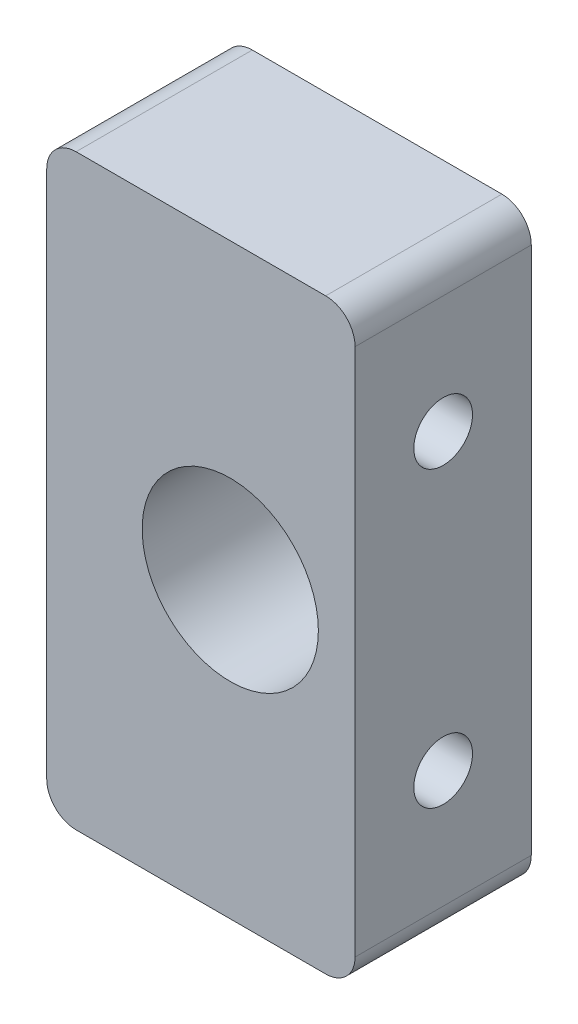
ISO-10303-21;
HEADER;
FILE_DESCRIPTION(('STEP AP214'),'2;1');
FILE_NAME('part.step','',(''),(''),'','','');
FILE_SCHEMA(('AUTOMOTIVE_DESIGN { 1 0 10303 214 1 1 1 1 }'));
ENDSEC;
DATA;
#1=APPLICATION_CONTEXT('core data for automotive mechanical design processes');
#2=APPLICATION_PROTOCOL_DEFINITION('international standard','automotive_design',2000,#1);
#3=PRODUCT_CONTEXT('',#1,'mechanical');
#4=PRODUCT('Part','Part','',(#3));
#5=PRODUCT_RELATED_PRODUCT_CATEGORY('part','',(#4));
#6=PRODUCT_DEFINITION_FORMATION('','',#4);
#7=PRODUCT_DEFINITION_CONTEXT('part definition',#1,'design');
#8=PRODUCT_DEFINITION('design','',#6,#7);
#9=PRODUCT_DEFINITION_SHAPE('','',#8);
#10=(LENGTH_UNIT() NAMED_UNIT(*) SI_UNIT(.MILLI.,.METRE.));
#11=(NAMED_UNIT(*) PLANE_ANGLE_UNIT() SI_UNIT($,.RADIAN.));
#12=(NAMED_UNIT(*) SI_UNIT($,.STERADIAN.) SOLID_ANGLE_UNIT());
#13=UNCERTAINTY_MEASURE_WITH_UNIT(LENGTH_MEASURE(1.E-05),#10,'distance_accuracy_value','');
#14=(GEOMETRIC_REPRESENTATION_CONTEXT(3) GLOBAL_UNCERTAINTY_ASSIGNED_CONTEXT((#13)) GLOBAL_UNIT_ASSIGNED_CONTEXT((#10,
#11,#12)) REPRESENTATION_CONTEXT('',''));
#15=CARTESIAN_POINT('',(0.,0.,0.));
#16=DIRECTION('',(0.,0.,1.));
#17=DIRECTION('',(1.,0.,0.));
#18=AXIS2_PLACEMENT_3D('',#15,#16,#17);
#19=CARTESIAN_POINT('',(21.001,10.,6.));
#20=DIRECTION('',(-1.,0.,0.));
#21=DIRECTION('',(0.,0.,1.));
#22=AXIS2_PLACEMENT_3D('',#19,#20,#21);
#23=CYLINDRICAL_SURFACE('',#22,2.);
#24=CARTESIAN_POINT('',(21.,10.,6.));
#25=DIRECTION('',(-1.,0.,0.));
#26=DIRECTION('',(0.,0.,1.));
#27=AXIS2_PLACEMENT_3D('',#24,#25,#26);
#28=CIRCLE('',#27,2.);
#29=CARTESIAN_POINT('',(21.,10.,8.));
#30=VERTEX_POINT('',#29);
#31=EDGE_CURVE('E205',#30,#30,#28,.F.);
#32=ORIENTED_EDGE('',*,*,#31,.T.);
#33=EDGE_LOOP('',(#32));
#34=FACE_BOUND('',#33,.T.);
#35=CARTESIAN_POINT('',(1.5,10.,6.));
#36=DIRECTION('',(-1.,0.,0.));
#37=DIRECTION('',(0.,0.,1.));
#38=AXIS2_PLACEMENT_3D('',#35,#36,#37);
#39=CIRCLE('',#38,2.);
#40=CARTESIAN_POINT('',(1.5,10.,8.));
#41=VERTEX_POINT('',#40);
#42=EDGE_CURVE('E202',#41,#41,#39,.F.);
#43=ORIENTED_EDGE('',*,*,#42,.F.);
#44=EDGE_LOOP('',(#43));
#45=FACE_BOUND('',#44,.T.);
#46=ADVANCED_FACE('F35',(#34,#45),#23,.F.);
#47=CARTESIAN_POINT('',(21.001,30.,6.));
#48=DIRECTION('',(-1.,0.,0.));
#49=DIRECTION('',(0.,0.,1.));
#50=AXIS2_PLACEMENT_3D('',#47,#48,#49);
#51=CYLINDRICAL_SURFACE('',#50,2.);
#52=CARTESIAN_POINT('',(21.,30.,6.));
#53=DIRECTION('',(-1.,0.,0.));
#54=DIRECTION('',(0.,0.,1.));
#55=AXIS2_PLACEMENT_3D('',#52,#53,#54);
#56=CIRCLE('',#55,2.);
#57=CARTESIAN_POINT('',(21.,30.,8.));
#58=VERTEX_POINT('',#57);
#59=EDGE_CURVE('E186',#58,#58,#56,.F.);
#60=ORIENTED_EDGE('',*,*,#59,.T.);
#61=EDGE_LOOP('',(#60));
#62=FACE_BOUND('',#61,.T.);
#63=CARTESIAN_POINT('',(1.5,30.,6.));
#64=DIRECTION('',(-1.,0.,0.));
#65=DIRECTION('',(0.,0.,1.));
#66=AXIS2_PLACEMENT_3D('',#63,#64,#65);
#67=CIRCLE('',#66,2.);
#68=CARTESIAN_POINT('',(1.5,30.,8.));
#69=VERTEX_POINT('',#68);
#70=EDGE_CURVE('E237',#69,#69,#67,.F.);
#71=ORIENTED_EDGE('',*,*,#70,.F.);
#72=EDGE_LOOP('',(#71));
#73=FACE_BOUND('',#72,.T.);
#74=ADVANCED_FACE('F284',(#62,#73),#51,.F.);
#75=CARTESIAN_POINT('',(0.,0.,12.));
#76=DIRECTION('',(1.,0.,0.));
#77=DIRECTION('',(0.,0.,-1.));
#78=AXIS2_PLACEMENT_3D('',#75,#76,#77);
#79=PLANE('',#78);
#80=CARTESIAN_POINT('',(0.,10.,6.));
#81=DIRECTION('',(-1.,0.,0.));
#82=DIRECTION('',(0.,0.,1.));
#83=AXIS2_PLACEMENT_3D('',#80,#81,#82);
#84=CIRCLE('',#83,3.75);
#85=CARTESIAN_POINT('',(0.,10.,9.75));
#86=VERTEX_POINT('',#85);
#87=EDGE_CURVE('E222',#86,#86,#84,.T.);
#88=ORIENTED_EDGE('',*,*,#87,.F.);
#89=EDGE_LOOP('',(#88));
#90=FACE_BOUND('',#89,.T.);
#91=CARTESIAN_POINT('',(0.,30.,6.));
#92=DIRECTION('',(-1.,0.,0.));
#93=DIRECTION('',(0.,0.,1.));
#94=AXIS2_PLACEMENT_3D('',#91,#92,#93);
#95=CIRCLE('',#94,3.75);
#96=CARTESIAN_POINT('',(0.,30.,9.75));
#97=VERTEX_POINT('',#96);
#98=EDGE_CURVE('E197',#97,#97,#95,.T.);
#99=ORIENTED_EDGE('',*,*,#98,.F.);
#100=EDGE_LOOP('',(#99));
#101=FACE_BOUND('',#100,.T.);
#102=DIRECTION('',(0.,-1.,0.));
#103=VECTOR('',#102,1.);
#104=CARTESIAN_POINT('',(0.,0.,0.));
#105=LINE('',#104,#103);
#106=CARTESIAN_POINT('',(0.,38.,0.));
#107=VERTEX_POINT('',#106);
#108=CARTESIAN_POINT('',(0.,2.,0.));
#109=VERTEX_POINT('',#108);
#110=EDGE_CURVE('E132',#107,#109,#105,.T.);
#111=ORIENTED_EDGE('',*,*,#110,.T.);
#112=DIRECTION('',(0.,0.,-1.));
#113=VECTOR('',#112,1.);
#114=CARTESIAN_POINT('',(0.,2.,12.));
#115=LINE('',#114,#113);
#116=CARTESIAN_POINT('',(0.,2.,12.));
#117=VERTEX_POINT('',#116);
#118=EDGE_CURVE('E256',#109,#117,#115,.F.);
#119=ORIENTED_EDGE('',*,*,#118,.T.);
#120=DIRECTION('',(0.,-1.,0.));
#121=VECTOR('',#120,1.);
#122=CARTESIAN_POINT('',(0.,0.,12.));
#123=LINE('',#122,#121);
#124=CARTESIAN_POINT('',(0.,38.,12.));
#125=VERTEX_POINT('',#124);
#126=EDGE_CURVE('E130',#125,#117,#123,.T.);
#127=ORIENTED_EDGE('',*,*,#126,.F.);
#128=DIRECTION('',(0.,0.,-1.));
#129=VECTOR('',#128,1.);
#130=CARTESIAN_POINT('',(0.,38.,12.));
#131=LINE('',#130,#129);
#132=EDGE_CURVE('E252',#125,#107,#131,.T.);
#133=ORIENTED_EDGE('',*,*,#132,.T.);
#134=EDGE_LOOP('',(#111,#119,#127,#133));
#135=FACE_BOUND('',#134,.T.);
#136=ADVANCED_FACE('F262',(#90,#101,#135),#79,.F.);
#137=CARTESIAN_POINT('',(0.,0.,12.));
#138=DIRECTION('',(0.,1.,0.));
#139=DIRECTION('',(0.,0.,1.));
#140=AXIS2_PLACEMENT_3D('',#137,#138,#139);
#141=PLANE('',#140);
#142=DIRECTION('',(1.,0.,0.));
#143=VECTOR('',#142,1.);
#144=CARTESIAN_POINT('',(0.,0.,0.));
#145=LINE('',#144,#143);
#146=CARTESIAN_POINT('',(2.,0.,0.));
#147=VERTEX_POINT('',#146);
#148=CARTESIAN_POINT('',(19.,0.,0.));
#149=VERTEX_POINT('',#148);
#150=EDGE_CURVE('E128',#147,#149,#145,.T.);
#151=ORIENTED_EDGE('',*,*,#150,.T.);
#152=DIRECTION('',(0.,0.,-1.));
#153=VECTOR('',#152,1.);
#154=CARTESIAN_POINT('',(19.,0.,12.));
#155=LINE('',#154,#153);
#156=CARTESIAN_POINT('',(19.,0.,12.));
#157=VERTEX_POINT('',#156);
#158=EDGE_CURVE('E106',#149,#157,#155,.F.);
#159=ORIENTED_EDGE('',*,*,#158,.T.);
#160=DIRECTION('',(1.,0.,0.));
#161=VECTOR('',#160,1.);
#162=CARTESIAN_POINT('',(0.,0.,12.));
#163=LINE('',#162,#161);
#164=CARTESIAN_POINT('',(2.,0.,12.));
#165=VERTEX_POINT('',#164);
#166=EDGE_CURVE('E162',#165,#157,#163,.T.);
#167=ORIENTED_EDGE('',*,*,#166,.F.);
#168=DIRECTION('',(0.,0.,-1.));
#169=VECTOR('',#168,1.);
#170=CARTESIAN_POINT('',(2.,0.,12.));
#171=LINE('',#170,#169);
#172=EDGE_CURVE('E111',#165,#147,#171,.T.);
#173=ORIENTED_EDGE('',*,*,#172,.T.);
#174=EDGE_LOOP('',(#151,#159,#167,#173));
#175=FACE_BOUND('',#174,.T.);
#176=ADVANCED_FACE('F273',(#175),#141,.F.);
#177=CARTESIAN_POINT('',(21.,0.,12.));
#178=DIRECTION('',(-1.,0.,0.));
#179=DIRECTION('',(0.,0.,1.));
#180=AXIS2_PLACEMENT_3D('',#177,#178,#179);
#181=PLANE('',#180);
#182=ORIENTED_EDGE('',*,*,#31,.F.);
#183=EDGE_LOOP('',(#182));
#184=FACE_BOUND('',#183,.T.);
#185=ORIENTED_EDGE('',*,*,#59,.F.);
#186=EDGE_LOOP('',(#185));
#187=FACE_BOUND('',#186,.T.);
#188=DIRECTION('',(0.,1.,0.));
#189=VECTOR('',#188,1.);
#190=CARTESIAN_POINT('',(21.,0.,12.));
#191=LINE('',#190,#189);
#192=CARTESIAN_POINT('',(21.,2.,12.));
#193=VERTEX_POINT('',#192);
#194=CARTESIAN_POINT('',(21.,38.,12.));
#195=VERTEX_POINT('',#194);
#196=EDGE_CURVE('E120',#193,#195,#191,.T.);
#197=ORIENTED_EDGE('',*,*,#196,.F.);
#198=DIRECTION('',(0.,0.,-1.));
#199=VECTOR('',#198,1.);
#200=CARTESIAN_POINT('',(21.,2.,12.));
#201=LINE('',#200,#199);
#202=CARTESIAN_POINT('',(21.,2.,0.));
#203=VERTEX_POINT('',#202);
#204=EDGE_CURVE('E105',#193,#203,#201,.T.);
#205=ORIENTED_EDGE('',*,*,#204,.T.);
#206=DIRECTION('',(0.,1.,0.));
#207=VECTOR('',#206,1.);
#208=CARTESIAN_POINT('',(21.,0.,0.));
#209=LINE('',#208,#207);
#210=CARTESIAN_POINT('',(21.,38.,0.));
#211=VERTEX_POINT('',#210);
#212=EDGE_CURVE('E118',#203,#211,#209,.T.);
#213=ORIENTED_EDGE('',*,*,#212,.T.);
#214=DIRECTION('',(0.,0.,-1.));
#215=VECTOR('',#214,1.);
#216=CARTESIAN_POINT('',(21.,38.,12.));
#217=LINE('',#216,#215);
#218=EDGE_CURVE('E122',#211,#195,#217,.F.);
#219=ORIENTED_EDGE('',*,*,#218,.T.);
#220=EDGE_LOOP('',(#197,#205,#213,#219));
#221=FACE_BOUND('',#220,.T.);
#222=ADVANCED_FACE('F117',(#184,#187,#221),#181,.F.);
#223=CARTESIAN_POINT('',(0.,40.,12.));
#224=DIRECTION('',(0.,-1.,0.));
#225=DIRECTION('',(0.,0.,-1.));
#226=AXIS2_PLACEMENT_3D('',#223,#224,#225);
#227=PLANE('',#226);
#228=DIRECTION('',(-1.,0.,0.));
#229=VECTOR('',#228,1.);
#230=CARTESIAN_POINT('',(0.,40.,12.));
#231=LINE('',#230,#229);
#232=CARTESIAN_POINT('',(19.,40.,12.));
#233=VERTEX_POINT('',#232);
#234=CARTESIAN_POINT('',(2.,40.,12.));
#235=VERTEX_POINT('',#234);
#236=EDGE_CURVE('E216',#233,#235,#231,.T.);
#237=ORIENTED_EDGE('',*,*,#236,.F.);
#238=DIRECTION('',(0.,0.,-1.));
#239=VECTOR('',#238,1.);
#240=CARTESIAN_POINT('',(19.,40.,12.));
#241=LINE('',#240,#239);
#242=CARTESIAN_POINT('',(19.,40.,0.));
#243=VERTEX_POINT('',#242);
#244=EDGE_CURVE('E12',#233,#243,#241,.T.);
#245=ORIENTED_EDGE('',*,*,#244,.T.);
#246=DIRECTION('',(-1.,0.,0.));
#247=VECTOR('',#246,1.);
#248=CARTESIAN_POINT('',(0.,40.,0.));
#249=LINE('',#248,#247);
#250=CARTESIAN_POINT('',(2.,40.,0.));
#251=VERTEX_POINT('',#250);
#252=EDGE_CURVE('E127',#243,#251,#249,.T.);
#253=ORIENTED_EDGE('',*,*,#252,.T.);
#254=DIRECTION('',(0.,0.,-1.));
#255=VECTOR('',#254,1.);
#256=CARTESIAN_POINT('',(2.,40.,12.));
#257=LINE('',#256,#255);
#258=EDGE_CURVE('E43',#251,#235,#257,.F.);
#259=ORIENTED_EDGE('',*,*,#258,.T.);
#260=EDGE_LOOP('',(#237,#245,#253,#259));
#261=FACE_BOUND('',#260,.T.);
#262=ADVANCED_FACE('F275',(#261),#227,.F.);
#263=CARTESIAN_POINT('',(0.,0.,12.));
#264=DIRECTION('',(0.,0.,-1.));
#265=DIRECTION('',(-1.,0.,0.));
#266=AXIS2_PLACEMENT_3D('',#263,#264,#265);
#267=PLANE('',#266);
#268=CARTESIAN_POINT('',(12.5,20.,12.));
#269=DIRECTION('',(0.,0.,1.));
#270=DIRECTION('',(1.,0.,0.));
#271=AXIS2_PLACEMENT_3D('',#268,#269,#270);
#272=CIRCLE('',#271,6.);
#273=CARTESIAN_POINT('',(18.5,20.,12.));
#274=VERTEX_POINT('',#273);
#275=EDGE_CURVE('E181',#274,#274,#272,.T.);
#276=ORIENTED_EDGE('',*,*,#275,.F.);
#277=EDGE_LOOP('',(#276));
#278=FACE_BOUND('',#277,.T.);
#279=ORIENTED_EDGE('',*,*,#166,.T.);
#280=CARTESIAN_POINT('',(19.,2.,12.));
#281=DIRECTION('',(0.,0.,-1.));
#282=DIRECTION('',(-1.,0.,0.));
#283=AXIS2_PLACEMENT_3D('',#280,#281,#282);
#284=CIRCLE('',#283,2.);
#285=EDGE_CURVE('E250',#157,#193,#284,.F.);
#286=ORIENTED_EDGE('',*,*,#285,.T.);
#287=ORIENTED_EDGE('',*,*,#196,.T.);
#288=CARTESIAN_POINT('',(19.,38.,12.));
#289=DIRECTION('',(0.,0.,-1.));
#290=DIRECTION('',(-1.,0.,0.));
#291=AXIS2_PLACEMENT_3D('',#288,#289,#290);
#292=CIRCLE('',#291,2.);
#293=EDGE_CURVE('E56',#195,#233,#292,.F.);
#294=ORIENTED_EDGE('',*,*,#293,.T.);
#295=ORIENTED_EDGE('',*,*,#236,.T.);
#296=CARTESIAN_POINT('',(2.,38.,12.));
#297=DIRECTION('',(0.,0.,-1.));
#298=DIRECTION('',(-1.,0.,0.));
#299=AXIS2_PLACEMENT_3D('',#296,#297,#298);
#300=CIRCLE('',#299,2.);
#301=EDGE_CURVE('E245',#235,#125,#300,.F.);
#302=ORIENTED_EDGE('',*,*,#301,.T.);
#303=ORIENTED_EDGE('',*,*,#126,.T.);
#304=CARTESIAN_POINT('',(2.,2.,12.));
#305=DIRECTION('',(0.,0.,-1.));
#306=DIRECTION('',(-1.,0.,0.));
#307=AXIS2_PLACEMENT_3D('',#304,#305,#306);
#308=CIRCLE('',#307,2.);
#309=EDGE_CURVE('E248',#117,#165,#308,.F.);
#310=ORIENTED_EDGE('',*,*,#309,.T.);
#311=EDGE_LOOP('',(#279,#286,#287,#294,#295,#302,#303,#310));
#312=FACE_BOUND('',#311,.T.);
#313=ADVANCED_FACE('F267',(#278,#312),#267,.F.);
#314=CARTESIAN_POINT('',(0.,0.,0.));
#315=DIRECTION('',(0.,0.,-1.));
#316=DIRECTION('',(-1.,0.,0.));
#317=AXIS2_PLACEMENT_3D('',#314,#315,#316);
#318=PLANE('',#317);
#319=CARTESIAN_POINT('',(12.5,20.,0.));
#320=DIRECTION('',(0.,0.,-1.));
#321=DIRECTION('',(-1.,0.,0.));
#322=AXIS2_PLACEMENT_3D('',#319,#320,#321);
#323=CIRCLE('',#322,6.);
#324=CARTESIAN_POINT('',(6.5,20.,0.));
#325=VERTEX_POINT('',#324);
#326=EDGE_CURVE('E185',#325,#325,#323,.F.);
#327=ORIENTED_EDGE('',*,*,#326,.T.);
#328=EDGE_LOOP('',(#327));
#329=FACE_BOUND('',#328,.T.);
#330=ORIENTED_EDGE('',*,*,#212,.F.);
#331=CARTESIAN_POINT('',(19.,2.,0.));
#332=DIRECTION('',(0.,0.,-1.));
#333=DIRECTION('',(-1.,0.,0.));
#334=AXIS2_PLACEMENT_3D('',#331,#332,#333);
#335=CIRCLE('',#334,2.);
#336=EDGE_CURVE('E101',#203,#149,#335,.T.);
#337=ORIENTED_EDGE('',*,*,#336,.T.);
#338=ORIENTED_EDGE('',*,*,#150,.F.);
#339=CARTESIAN_POINT('',(2.,2.,0.));
#340=DIRECTION('',(0.,0.,-1.));
#341=DIRECTION('',(-1.,0.,0.));
#342=AXIS2_PLACEMENT_3D('',#339,#340,#341);
#343=CIRCLE('',#342,2.);
#344=EDGE_CURVE('E112',#147,#109,#343,.T.);
#345=ORIENTED_EDGE('',*,*,#344,.T.);
#346=ORIENTED_EDGE('',*,*,#110,.F.);
#347=CARTESIAN_POINT('',(2.,38.,0.));
#348=DIRECTION('',(0.,0.,-1.));
#349=DIRECTION('',(-1.,0.,0.));
#350=AXIS2_PLACEMENT_3D('',#347,#348,#349);
#351=CIRCLE('',#350,2.);
#352=EDGE_CURVE('E121',#107,#251,#351,.T.);
#353=ORIENTED_EDGE('',*,*,#352,.T.);
#354=ORIENTED_EDGE('',*,*,#252,.F.);
#355=CARTESIAN_POINT('',(19.,38.,0.));
#356=DIRECTION('',(0.,0.,-1.));
#357=DIRECTION('',(-1.,0.,0.));
#358=AXIS2_PLACEMENT_3D('',#355,#356,#357);
#359=CIRCLE('',#358,2.);
#360=EDGE_CURVE('E126',#243,#211,#359,.T.);
#361=ORIENTED_EDGE('',*,*,#360,.T.);
#362=EDGE_LOOP('',(#330,#337,#338,#345,#346,#353,#354,#361));
#363=FACE_BOUND('',#362,.T.);
#364=ADVANCED_FACE('F124',(#329,#363),#318,.T.);
#365=CARTESIAN_POINT('',(12.5,20.,-0.000999999999999265));
#366=DIRECTION('',(0.,0.,1.));
#367=DIRECTION('',(1.,0.,0.));
#368=AXIS2_PLACEMENT_3D('',#365,#366,#367);
#369=CYLINDRICAL_SURFACE('',#368,6.);
#370=ORIENTED_EDGE('',*,*,#326,.F.);
#371=EDGE_LOOP('',(#370));
#372=FACE_BOUND('',#371,.T.);
#373=ORIENTED_EDGE('',*,*,#275,.T.);
#374=EDGE_LOOP('',(#373));
#375=FACE_BOUND('',#374,.T.);
#376=ADVANCED_FACE('F298',(#372,#375),#369,.F.);
#377=CARTESIAN_POINT('',(1.5,30.,6.));
#378=DIRECTION('',(-1.,0.,0.));
#379=DIRECTION('',(0.,0.,1.));
#380=AXIS2_PLACEMENT_3D('',#377,#378,#379);
#381=PLANE('',#380);
#382=CARTESIAN_POINT('',(1.5,30.,6.));
#383=DIRECTION('',(-1.,0.,0.));
#384=DIRECTION('',(0.,0.,1.));
#385=AXIS2_PLACEMENT_3D('',#382,#383,#384);
#386=CIRCLE('',#385,3.75);
#387=CARTESIAN_POINT('',(1.5,30.,9.75));
#388=VERTEX_POINT('',#387);
#389=EDGE_CURVE('E201',#388,#388,#386,.T.);
#390=ORIENTED_EDGE('',*,*,#389,.T.);
#391=EDGE_LOOP('',(#390));
#392=FACE_BOUND('',#391,.T.);
#393=ORIENTED_EDGE('',*,*,#70,.T.);
#394=EDGE_LOOP('',(#393));
#395=FACE_BOUND('',#394,.T.);
#396=ADVANCED_FACE('F301',(#392,#395),#381,.T.);
#397=CARTESIAN_POINT('',(1.5,30.,6.));
#398=DIRECTION('',(-1.,0.,0.));
#399=DIRECTION('',(0.,0.,1.));
#400=AXIS2_PLACEMENT_3D('',#397,#398,#399);
#401=CYLINDRICAL_SURFACE('',#400,3.75);
#402=ORIENTED_EDGE('',*,*,#389,.F.);
#403=EDGE_LOOP('',(#402));
#404=FACE_BOUND('',#403,.T.);
#405=ORIENTED_EDGE('',*,*,#98,.T.);
#406=EDGE_LOOP('',(#405));
#407=FACE_BOUND('',#406,.T.);
#408=ADVANCED_FACE('F295',(#404,#407),#401,.F.);
#409=CARTESIAN_POINT('',(1.5,10.,6.));
#410=DIRECTION('',(-1.,0.,0.));
#411=DIRECTION('',(0.,0.,1.));
#412=AXIS2_PLACEMENT_3D('',#409,#410,#411);
#413=PLANE('',#412);
#414=CARTESIAN_POINT('',(1.5,10.,6.));
#415=DIRECTION('',(-1.,0.,0.));
#416=DIRECTION('',(0.,0.,1.));
#417=AXIS2_PLACEMENT_3D('',#414,#415,#416);
#418=CIRCLE('',#417,3.75);
#419=CARTESIAN_POINT('',(1.5,10.,9.75));
#420=VERTEX_POINT('',#419);
#421=EDGE_CURVE('E225',#420,#420,#418,.T.);
#422=ORIENTED_EDGE('',*,*,#421,.T.);
#423=EDGE_LOOP('',(#422));
#424=FACE_BOUND('',#423,.T.);
#425=ORIENTED_EDGE('',*,*,#42,.T.);
#426=EDGE_LOOP('',(#425));
#427=FACE_BOUND('',#426,.T.);
#428=ADVANCED_FACE('F352',(#424,#427),#413,.T.);
#429=CARTESIAN_POINT('',(1.5,10.,6.));
#430=DIRECTION('',(-1.,0.,0.));
#431=DIRECTION('',(0.,0.,1.));
#432=AXIS2_PLACEMENT_3D('',#429,#430,#431);
#433=CYLINDRICAL_SURFACE('',#432,3.75);
#434=ORIENTED_EDGE('',*,*,#421,.F.);
#435=EDGE_LOOP('',(#434));
#436=FACE_BOUND('',#435,.T.);
#437=ORIENTED_EDGE('',*,*,#87,.T.);
#438=EDGE_LOOP('',(#437));
#439=FACE_BOUND('',#438,.T.);
#440=ADVANCED_FACE('F321',(#436,#439),#433,.F.);
#441=CARTESIAN_POINT('',(19.,2.,12.));
#442=DIRECTION('',(0.,0.,-1.));
#443=DIRECTION('',(-1.,0.,0.));
#444=AXIS2_PLACEMENT_3D('',#441,#442,#443);
#445=CYLINDRICAL_SURFACE('',#444,2.);
#446=ORIENTED_EDGE('',*,*,#285,.F.);
#447=ORIENTED_EDGE('',*,*,#158,.F.);
#448=ORIENTED_EDGE('',*,*,#336,.F.);
#449=ORIENTED_EDGE('',*,*,#204,.F.);
#450=EDGE_LOOP('',(#446,#447,#448,#449));
#451=FACE_BOUND('',#450,.T.);
#452=ADVANCED_FACE('F104',(#451),#445,.T.);
#453=CARTESIAN_POINT('',(2.,2.,12.));
#454=DIRECTION('',(0.,0.,-1.));
#455=DIRECTION('',(-1.,0.,0.));
#456=AXIS2_PLACEMENT_3D('',#453,#454,#455);
#457=CYLINDRICAL_SURFACE('',#456,2.);
#458=ORIENTED_EDGE('',*,*,#309,.F.);
#459=ORIENTED_EDGE('',*,*,#118,.F.);
#460=ORIENTED_EDGE('',*,*,#344,.F.);
#461=ORIENTED_EDGE('',*,*,#172,.F.);
#462=EDGE_LOOP('',(#458,#459,#460,#461));
#463=FACE_BOUND('',#462,.T.);
#464=ADVANCED_FACE('F271',(#463),#457,.T.);
#465=CARTESIAN_POINT('',(19.,38.,12.));
#466=DIRECTION('',(0.,0.,-1.));
#467=DIRECTION('',(-1.,0.,0.));
#468=AXIS2_PLACEMENT_3D('',#465,#466,#467);
#469=CYLINDRICAL_SURFACE('',#468,2.);
#470=ORIENTED_EDGE('',*,*,#293,.F.);
#471=ORIENTED_EDGE('',*,*,#218,.F.);
#472=ORIENTED_EDGE('',*,*,#360,.F.);
#473=ORIENTED_EDGE('',*,*,#244,.F.);
#474=EDGE_LOOP('',(#470,#471,#472,#473));
#475=FACE_BOUND('',#474,.T.);
#476=ADVANCED_FACE('F278',(#475),#469,.T.);
#477=CARTESIAN_POINT('',(2.,38.,12.));
#478=DIRECTION('',(0.,0.,-1.));
#479=DIRECTION('',(-1.,0.,0.));
#480=AXIS2_PLACEMENT_3D('',#477,#478,#479);
#481=CYLINDRICAL_SURFACE('',#480,2.);
#482=ORIENTED_EDGE('',*,*,#301,.F.);
#483=ORIENTED_EDGE('',*,*,#258,.F.);
#484=ORIENTED_EDGE('',*,*,#352,.F.);
#485=ORIENTED_EDGE('',*,*,#132,.F.);
#486=EDGE_LOOP('',(#482,#483,#484,#485));
#487=FACE_BOUND('',#486,.T.);
#488=ADVANCED_FACE('F37',(#487),#481,.T.);
#489=CLOSED_SHELL('',(#46,#74,#136,#176,#222,#262,#313,#364,#376,#396,#408,#428,#440,#452,#464,
#476,#488));
#490=MANIFOLD_SOLID_BREP('B2',#489);
#491=ADVANCED_BREP_SHAPE_REPRESENTATION('',(#18,#490),#14);
#492=SHAPE_DEFINITION_REPRESENTATION(#9,#491);
ENDSEC;
END-ISO-10303-21;
